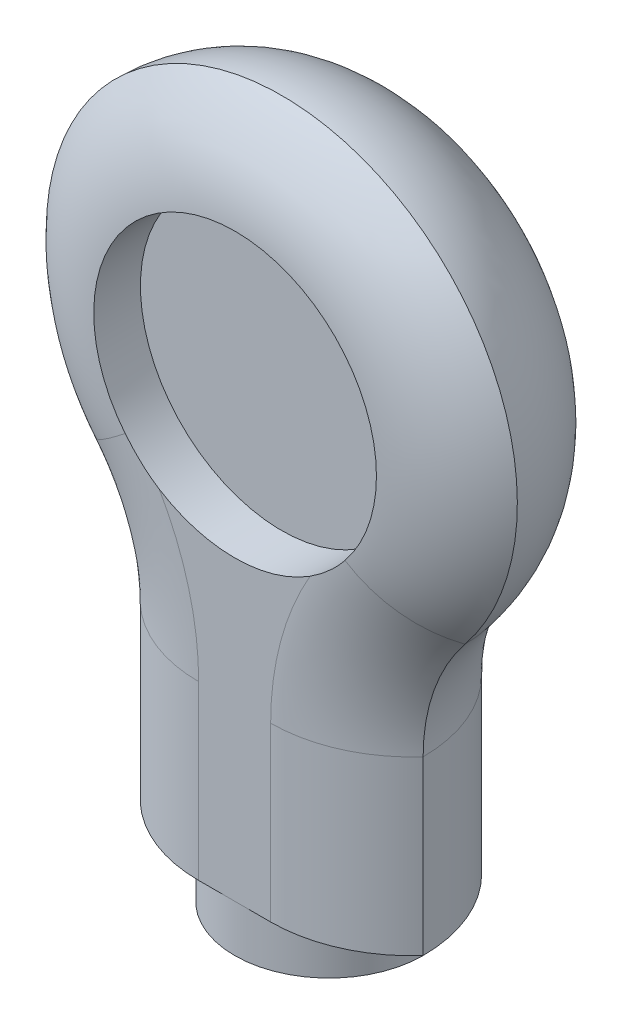
ISO-10303-21;
HEADER;
FILE_DESCRIPTION(('STEP AP214'),'2;1');
FILE_NAME('part.step','',(''),(''),'','','');
FILE_SCHEMA(('AUTOMOTIVE_DESIGN { 1 0 10303 214 1 1 1 1 }'));
ENDSEC;
DATA;
#1=APPLICATION_CONTEXT('core data for automotive mechanical design processes');
#2=APPLICATION_PROTOCOL_DEFINITION('international standard','automotive_design',2000,#1);
#3=PRODUCT_CONTEXT('',#1,'mechanical');
#4=PRODUCT('Part','Part','',(#3));
#5=PRODUCT_RELATED_PRODUCT_CATEGORY('part','',(#4));
#6=PRODUCT_DEFINITION_FORMATION('','',#4);
#7=PRODUCT_DEFINITION_CONTEXT('part definition',#1,'design');
#8=PRODUCT_DEFINITION('design','',#6,#7);
#9=PRODUCT_DEFINITION_SHAPE('','',#8);
#10=(LENGTH_UNIT() NAMED_UNIT(*) SI_UNIT(.MILLI.,.METRE.));
#11=(NAMED_UNIT(*) PLANE_ANGLE_UNIT() SI_UNIT($,.RADIAN.));
#12=(NAMED_UNIT(*) SI_UNIT($,.STERADIAN.) SOLID_ANGLE_UNIT());
#13=UNCERTAINTY_MEASURE_WITH_UNIT(LENGTH_MEASURE(1.E-05),#10,'distance_accuracy_value','');
#14=(GEOMETRIC_REPRESENTATION_CONTEXT(3) GLOBAL_UNCERTAINTY_ASSIGNED_CONTEXT((#13)) GLOBAL_UNIT_ASSIGNED_CONTEXT((#10,
#11,#12)) REPRESENTATION_CONTEXT('',''));
#15=CARTESIAN_POINT('',(0.,0.,0.));
#16=DIRECTION('',(0.,0.,1.));
#17=DIRECTION('',(1.,0.,0.));
#18=AXIS2_PLACEMENT_3D('',#15,#16,#17);
#19=CARTESIAN_POINT('',(1448.97204941986,-6.55492904493826,-19.9999999999894));
#20=DIRECTION('',(0.,1.,0.));
#21=DIRECTION('',(0.,0.,1.));
#22=AXIS2_PLACEMENT_3D('',#19,#20,#21);
#23=PLANE('',#22);
#24=CARTESIAN_POINT('',(1448.97204941986,-6.55492904493826,-4.9999999999894));
#25=DIRECTION('',(0.,1.,0.));
#26=DIRECTION('',(0.,0.,1.));
#27=AXIS2_PLACEMENT_3D('',#24,#25,#26);
#28=CIRCLE('',#27,15.);
#29=CARTESIAN_POINT('',(1448.97204941986,-6.55492904493826,-19.9999999999895));
#30=VERTEX_POINT('',#29);
#31=CARTESIAN_POINT('',(1463.97204941986,-6.55492904493826,-4.9999999999894));
#32=VERTEX_POINT('',#31);
#33=EDGE_CURVE('E128',#30,#32,#28,.F.);
#34=ORIENTED_EDGE('',*,*,#33,.T.);
#35=CARTESIAN_POINT('',(1452.79170953236,-6.55492904493826,-14.9999999999894));
#36=DIRECTION('',(0.,1.,0.));
#37=DIRECTION('',(0.,0.,1.));
#38=AXIS2_PLACEMENT_3D('',#35,#36,#37);
#39=CIRCLE('',#38,15.);
#40=CARTESIAN_POINT('',(1452.79170953236,-6.55492904493826,1.06026298851702E-11));
#41=VERTEX_POINT('',#40);
#42=EDGE_CURVE('E11',#32,#41,#39,.F.);
#43=ORIENTED_EDGE('',*,*,#42,.T.);
#44=DIRECTION('',(-1.,0.,0.));
#45=VECTOR('',#44,1.);
#46=CARTESIAN_POINT('',(1448.97204941986,-6.55492904493826,1.06026298851702E-11));
#47=LINE('',#46,#45);
#48=CARTESIAN_POINT('',(1448.97204941986,-6.55492904493826,1.06026298851702E-11));
#49=VERTEX_POINT('',#48);
#50=EDGE_CURVE('E131',#41,#49,#47,.T.);
#51=ORIENTED_EDGE('',*,*,#50,.T.);
#52=CARTESIAN_POINT('',(1448.97204941986,-6.55492904493826,-9.9999999999894));
#53=DIRECTION('',(0.,-1.,0.));
#54=DIRECTION('',(0.,0.,-1.));
#55=AXIS2_PLACEMENT_3D('',#52,#53,#54);
#56=CIRCLE('',#55,10.0000000000001);
#57=EDGE_CURVE('E126',#30,#49,#56,.T.);
#58=ORIENTED_EDGE('',*,*,#57,.F.);
#59=EDGE_LOOP('',(#34,#43,#51,#58));
#60=FACE_BOUND('',#59,.T.);
#61=ADVANCED_FACE('F33',(#60),#23,.F.);
#62=CARTESIAN_POINT('',(1445.15238930736,-6.55492904493826,1.06026298851702E-11));
#63=VERTEX_POINT('',#62);
#64=EDGE_CURVE('E283',#49,#63,#47,.T.);
#65=ORIENTED_EDGE('',*,*,#64,.T.);
#66=CARTESIAN_POINT('',(1445.15238930736,-6.55492904493826,-14.9999999999894));
#67=DIRECTION('',(0.,1.,0.));
#68=DIRECTION('',(0.,0.,1.));
#69=AXIS2_PLACEMENT_3D('',#66,#67,#68);
#70=CIRCLE('',#69,15.);
#71=CARTESIAN_POINT('',(1433.97204941986,-6.55492904493826,-4.9999999999894));
#72=VERTEX_POINT('',#71);
#73=EDGE_CURVE('E116',#63,#72,#70,.F.);
#74=ORIENTED_EDGE('',*,*,#73,.T.);
#75=CARTESIAN_POINT('',(1448.97204941986,-6.55492904493826,-4.9999999999894));
#76=DIRECTION('',(0.,1.,0.));
#77=DIRECTION('',(0.,0.,1.));
#78=AXIS2_PLACEMENT_3D('',#75,#76,#77);
#79=CIRCLE('',#78,15.);
#80=EDGE_CURVE('E108',#72,#30,#79,.F.);
#81=ORIENTED_EDGE('',*,*,#80,.T.);
#82=EDGE_CURVE('E113',#49,#30,#56,.T.);
#83=ORIENTED_EDGE('',*,*,#82,.F.);
#84=EDGE_LOOP('',(#65,#74,#81,#83));
#85=FACE_BOUND('',#84,.T.);
#86=ADVANCED_FACE('F111',(#85),#23,.F.);
#87=CARTESIAN_POINT('',(1413.97204941986,11.715728752538,-19.9999999999894));
#88=DIRECTION('',(0.,0.,1.));
#89=DIRECTION('',(1.,0.,0.));
#90=AXIS2_PLACEMENT_3D('',#87,#88,#89);
#91=PLANE('',#90);
#92=CARTESIAN_POINT('',(1483.97204941986,11.715728752538,-19.9999999999894));
#93=DIRECTION('',(0.,0.,1.));
#94=DIRECTION('',(1.,0.,0.));
#95=AXIS2_PLACEMENT_3D('',#92,#93,#94);
#96=CIRCLE('',#95,34.9999999999999);
#97=CARTESIAN_POINT('',(1456.74982719764,33.7146063894528,-19.9999999999894));
#98=VERTEX_POINT('',#97);
#99=CARTESIAN_POINT('',(1448.97204941986,11.715728752538,-19.9999999999894));
#100=VERTEX_POINT('',#99);
#101=EDGE_CURVE('E246',#98,#100,#96,.T.);
#102=ORIENTED_EDGE('',*,*,#101,.T.);
#103=CARTESIAN_POINT('',(1413.97204941986,11.715728752538,-19.9999999999894));
#104=DIRECTION('',(0.,0.,1.));
#105=DIRECTION('',(1.,0.,0.));
#106=AXIS2_PLACEMENT_3D('',#103,#104,#105);
#107=CIRCLE('',#106,35.0000000000001);
#108=CARTESIAN_POINT('',(1441.19427164209,33.7146063894526,-19.9999999999894));
#109=VERTEX_POINT('',#108);
#110=EDGE_CURVE('E249',#100,#109,#107,.T.);
#111=ORIENTED_EDGE('',*,*,#110,.T.);
#112=CARTESIAN_POINT('',(1448.97204941986,40.,-19.9999999999894));
#113=DIRECTION('',(0.,0.,1.));
#114=DIRECTION('',(1.,0.,0.));
#115=AXIS2_PLACEMENT_3D('',#112,#113,#114);
#116=CIRCLE('',#115,9.99999999999998);
#117=EDGE_CURVE('E121',#109,#98,#116,.F.);
#118=ORIENTED_EDGE('',*,*,#117,.T.);
#119=EDGE_LOOP('',(#102,#111,#118));
#120=FACE_BOUND('',#119,.T.);
#121=ADVANCED_FACE('F219',(#120),#91,.F.);
#122=CARTESIAN_POINT('',(1413.97204941986,11.715728752538,1.06026298851702E-11));
#123=DIRECTION('',(0.,0.,1.));
#124=DIRECTION('',(1.,0.,0.));
#125=AXIS2_PLACEMENT_3D('',#122,#123,#124);
#126=PLANE('',#125);
#127=CARTESIAN_POINT('',(1413.97204941986,11.715728752538,1.06026298851702E-11));
#128=DIRECTION('',(0.,0.,1.));
#129=DIRECTION('',(1.,0.,0.));
#130=AXIS2_PLACEMENT_3D('',#127,#128,#129);
#131=CIRCLE('',#130,31.1803398874991);
#132=CARTESIAN_POINT('',(1440.9716979601,27.3116440576298,3.34515958499169E-12));
#133=VERTEX_POINT('',#132);
#134=CARTESIAN_POINT('',(1445.15238930736,11.715728752538,1.06026298851702E-11));
#135=VERTEX_POINT('',#134);
#136=EDGE_CURVE('E167',#133,#135,#131,.F.);
#137=ORIENTED_EDGE('',*,*,#136,.T.);
#138=DIRECTION('',(0.,-1.,0.));
#139=VECTOR('',#138,1.);
#140=CARTESIAN_POINT('',(1445.15238930736,-6.55492904493826,1.06026298851702E-11));
#141=LINE('',#140,#139);
#142=EDGE_CURVE('E169',#135,#63,#141,.T.);
#143=ORIENTED_EDGE('',*,*,#142,.T.);
#144=ORIENTED_EDGE('',*,*,#64,.F.);
#145=ORIENTED_EDGE('',*,*,#50,.F.);
#146=DIRECTION('',(0.,-1.,0.));
#147=VECTOR('',#146,1.);
#148=CARTESIAN_POINT('',(1452.79170953236,11.715728752538,1.06026298851702E-11));
#149=LINE('',#148,#147);
#150=CARTESIAN_POINT('',(1452.79170953236,11.715728752538,1.06026298851702E-11));
#151=VERTEX_POINT('',#150);
#152=EDGE_CURVE('E164',#41,#151,#149,.F.);
#153=ORIENTED_EDGE('',*,*,#152,.T.);
#154=CARTESIAN_POINT('',(1483.97204941986,11.715728752538,1.06026298851702E-11));
#155=DIRECTION('',(0.,0.,1.));
#156=DIRECTION('',(1.,0.,0.));
#157=AXIS2_PLACEMENT_3D('',#154,#155,#156);
#158=CIRCLE('',#157,31.1803398874989);
#159=CARTESIAN_POINT('',(1456.97240087963,27.3116440576301,0.));
#160=VERTEX_POINT('',#159);
#161=EDGE_CURVE('E162',#151,#160,#158,.F.);
#162=ORIENTED_EDGE('',*,*,#161,.T.);
#163=CARTESIAN_POINT('',(1448.97204941986,40.,0.));
#164=DIRECTION('',(0.,0.,1.));
#165=DIRECTION('',(1.,0.,0.));
#166=AXIS2_PLACEMENT_3D('',#163,#164,#165);
#167=CIRCLE('',#166,14.9999999999999);
#168=EDGE_CURVE('E275',#133,#160,#167,.T.);
#169=ORIENTED_EDGE('',*,*,#168,.F.);
#170=EDGE_LOOP('',(#137,#143,#144,#145,#153,#162,#169));
#171=FACE_BOUND('',#170,.T.);
#172=ADVANCED_FACE('F222',(#171),#126,.T.);
#173=CARTESIAN_POINT('',(1448.97204941986,-11.5549290449383,-9.9999999999894));
#174=DIRECTION('',(0.,1.,0.));
#175=DIRECTION('',(0.,0.,1.));
#176=AXIS2_PLACEMENT_3D('',#173,#174,#175);
#177=CYLINDRICAL_SURFACE('',#176,10.0000000000001);
#178=CARTESIAN_POINT('',(1448.97204941986,-11.5549290449383,-9.9999999999894));
#179=DIRECTION('',(0.,-1.,0.));
#180=DIRECTION('',(0.,0.,-1.));
#181=AXIS2_PLACEMENT_3D('',#178,#179,#180);
#182=CIRCLE('',#181,10.0000000000001);
#183=CARTESIAN_POINT('',(1448.97204941986,-11.5549290449383,-19.9999999999895));
#184=VERTEX_POINT('',#183);
#185=EDGE_CURVE('E133',#184,#184,#182,.T.);
#186=ORIENTED_EDGE('',*,*,#185,.F.);
#187=EDGE_LOOP('',(#186));
#188=FACE_BOUND('',#187,.T.);
#189=ORIENTED_EDGE('',*,*,#57,.T.);
#190=ORIENTED_EDGE('',*,*,#82,.T.);
#191=EDGE_LOOP('',(#189,#190));
#192=FACE_BOUND('',#191,.T.);
#193=ADVANCED_FACE('F136',(#188,#192),#177,.T.);
#194=CARTESIAN_POINT('',(1448.97204941986,-11.5549290449383,-9.9999999999894));
#195=DIRECTION('',(0.,-1.,0.));
#196=DIRECTION('',(0.,0.,-1.));
#197=AXIS2_PLACEMENT_3D('',#194,#195,#196);
#198=PLANE('',#197);
#199=ORIENTED_EDGE('',*,*,#185,.T.);
#200=EDGE_LOOP('',(#199));
#201=FACE_BOUND('',#200,.T.);
#202=ADVANCED_FACE('F189',(#201),#198,.T.);
#203=CARTESIAN_POINT('',(1483.97204941986,11.715728752538,-4.9999999999894));
#204=DIRECTION('',(0.,0.,1.));
#205=DIRECTION('',(1.,0.,0.));
#206=AXIS2_PLACEMENT_3D('',#203,#204,#205);
#207=TOROIDAL_SURFACE('',#206,34.9999999999999,15.);
#208=CARTESIAN_POINT('',(1448.97204941986,11.715728752538,-4.9999999999894));
#209=DIRECTION('',(0.,-1.,0.));
#210=DIRECTION('',(0.,0.,-1.));
#211=AXIS2_PLACEMENT_3D('',#208,#209,#210);
#212=CIRCLE('',#211,15.);
#213=CARTESIAN_POINT('',(1463.97204941986,11.715728752538,-4.9999999999894));
#214=VERTEX_POINT('',#213);
#215=EDGE_CURVE('E153',#100,#214,#212,.T.);
#216=ORIENTED_EDGE('',*,*,#215,.F.);
#217=ORIENTED_EDGE('',*,*,#101,.F.);
#218=CARTESIAN_POINT('',(1456.74982719764,33.7146063894529,-4.9999999999894));
#219=DIRECTION('',(0.628539361054708,0.777777777777778,0.));
#220=DIRECTION('',(-0.777777777777778,0.628539361054708,0.));
#221=AXIS2_PLACEMENT_3D('',#218,#219,#220);
#222=CIRCLE('',#221,15.);
#223=CARTESIAN_POINT('',(1468.41649386431,24.2865159736323,-4.9999999999894));
#224=VERTEX_POINT('',#223);
#225=EDGE_CURVE('E134',#224,#98,#222,.T.);
#226=ORIENTED_EDGE('',*,*,#225,.F.);
#227=CARTESIAN_POINT('',(1483.97204941986,11.715728752538,-4.9999999999894));
#228=DIRECTION('',(0.,0.,1.));
#229=DIRECTION('',(1.,0.,0.));
#230=AXIS2_PLACEMENT_3D('',#227,#228,#229);
#231=CIRCLE('',#230,19.9999999999999);
#232=EDGE_CURVE('E146',#214,#224,#231,.F.);
#233=ORIENTED_EDGE('',*,*,#232,.F.);
#234=EDGE_LOOP('',(#216,#217,#226,#233));
#235=FACE_BOUND('',#234,.T.);
#236=ADVANCED_FACE('F234',(#235),#207,.T.);
#237=CARTESIAN_POINT('',(1448.97204941986,40.,-4.9999999999894));
#238=DIRECTION('',(0.,0.,1.));
#239=DIRECTION('',(1.,0.,0.));
#240=AXIS2_PLACEMENT_3D('',#237,#238,#239);
#241=DEGENERATE_TOROIDAL_SURFACE('',#240,9.99999999999998,15.,.T.);
#242=ORIENTED_EDGE('',*,*,#225,.T.);
#243=ORIENTED_EDGE('',*,*,#117,.F.);
#244=CARTESIAN_POINT('',(1441.19427164209,33.7146063894528,-4.9999999999894));
#245=DIRECTION('',(0.628539361054722,-0.777777777777768,0.));
#246=DIRECTION('',(0.777777777777768,0.628539361054722,0.));
#247=AXIS2_PLACEMENT_3D('',#244,#245,#246);
#248=CIRCLE('',#247,15.);
#249=CARTESIAN_POINT('',(1429.52760497542,24.2865159736321,-4.9999999999894));
#250=VERTEX_POINT('',#249);
#251=EDGE_CURVE('E151',#250,#109,#248,.T.);
#252=ORIENTED_EDGE('',*,*,#251,.F.);
#253=CARTESIAN_POINT('',(1448.97204941986,40.,-4.9999999999894));
#254=DIRECTION('',(0.,0.,1.));
#255=DIRECTION('',(1.,0.,0.));
#256=AXIS2_PLACEMENT_3D('',#253,#254,#255);
#257=CIRCLE('',#256,25.);
#258=EDGE_CURVE('E165',#224,#250,#257,.T.);
#259=ORIENTED_EDGE('',*,*,#258,.F.);
#260=EDGE_LOOP('',(#242,#243,#252,#259));
#261=FACE_BOUND('',#260,.T.);
#262=ADVANCED_FACE('F232',(#261),#241,.T.);
#263=CARTESIAN_POINT('',(1448.97204941986,-6.55492904493826,-4.9999999999894));
#264=DIRECTION('',(0.,-1.,0.));
#265=DIRECTION('',(0.,0.,-1.));
#266=AXIS2_PLACEMENT_3D('',#263,#264,#265);
#267=CYLINDRICAL_SURFACE('',#266,15.);
#268=DIRECTION('',(0.,1.,0.));
#269=VECTOR('',#268,1.);
#270=CARTESIAN_POINT('',(1463.97204941986,11.715728752538,-4.9999999999894));
#271=LINE('',#270,#269);
#272=EDGE_CURVE('E144',#32,#214,#271,.T.);
#273=ORIENTED_EDGE('',*,*,#272,.F.);
#274=ORIENTED_EDGE('',*,*,#33,.F.);
#275=DIRECTION('',(0.,1.,0.));
#276=VECTOR('',#275,1.);
#277=CARTESIAN_POINT('',(1448.97204941986,-6.55492904493826,-19.9999999999894));
#278=LINE('',#277,#276);
#279=EDGE_CURVE('E141',#100,#30,#278,.F.);
#280=ORIENTED_EDGE('',*,*,#279,.F.);
#281=ORIENTED_EDGE('',*,*,#215,.T.);
#282=EDGE_LOOP('',(#273,#274,#280,#281));
#283=FACE_BOUND('',#282,.T.);
#284=ADVANCED_FACE('F139',(#283),#267,.T.);
#285=CARTESIAN_POINT('',(1413.97204941986,11.715728752538,-4.9999999999894));
#286=DIRECTION('',(0.,0.,1.));
#287=DIRECTION('',(1.,0.,0.));
#288=AXIS2_PLACEMENT_3D('',#285,#286,#287);
#289=TOROIDAL_SURFACE('',#288,35.0000000000001,15.);
#290=ORIENTED_EDGE('',*,*,#251,.T.);
#291=ORIENTED_EDGE('',*,*,#110,.F.);
#292=CARTESIAN_POINT('',(1448.97204941986,11.715728752538,-4.9999999999894));
#293=DIRECTION('',(0.,-1.,0.));
#294=DIRECTION('',(0.,0.,-1.));
#295=AXIS2_PLACEMENT_3D('',#292,#293,#294);
#296=CIRCLE('',#295,15.);
#297=CARTESIAN_POINT('',(1433.97204941986,11.715728752538,-4.9999999999894));
#298=VERTEX_POINT('',#297);
#299=EDGE_CURVE('E150',#298,#100,#296,.T.);
#300=ORIENTED_EDGE('',*,*,#299,.F.);
#301=CARTESIAN_POINT('',(1413.97204941986,11.715728752538,-4.9999999999894));
#302=DIRECTION('',(0.,0.,1.));
#303=DIRECTION('',(1.,0.,0.));
#304=AXIS2_PLACEMENT_3D('',#301,#302,#303);
#305=CIRCLE('',#304,20.0000000000001);
#306=EDGE_CURVE('E253',#250,#298,#305,.F.);
#307=ORIENTED_EDGE('',*,*,#306,.F.);
#308=EDGE_LOOP('',(#290,#291,#300,#307));
#309=FACE_BOUND('',#308,.T.);
#310=ADVANCED_FACE('F226',(#309),#289,.T.);
#311=CARTESIAN_POINT('',(1448.97204941986,11.715728752538,-4.9999999999894));
#312=DIRECTION('',(0.,1.,0.));
#313=DIRECTION('',(0.,0.,1.));
#314=AXIS2_PLACEMENT_3D('',#311,#312,#313);
#315=CYLINDRICAL_SURFACE('',#314,15.);
#316=ORIENTED_EDGE('',*,*,#80,.F.);
#317=DIRECTION('',(0.,1.,0.));
#318=VECTOR('',#317,1.);
#319=CARTESIAN_POINT('',(1433.97204941986,-6.55492904493826,-4.9999999999894));
#320=LINE('',#319,#318);
#321=EDGE_CURVE('E122',#298,#72,#320,.F.);
#322=ORIENTED_EDGE('',*,*,#321,.F.);
#323=ORIENTED_EDGE('',*,*,#299,.T.);
#324=ORIENTED_EDGE('',*,*,#279,.T.);
#325=EDGE_LOOP('',(#316,#322,#323,#324));
#326=FACE_BOUND('',#325,.T.);
#327=ADVANCED_FACE('F148',(#326),#315,.T.);
#328=CARTESIAN_POINT('',(1448.97204941986,40.,-5.));
#329=DIRECTION('',(0.,0.,1.));
#330=DIRECTION('',(1.,0.,0.));
#331=AXIS2_PLACEMENT_3D('',#328,#329,#330);
#332=CYLINDRICAL_SURFACE('',#331,14.9999999999999);
#333=CARTESIAN_POINT('',(1448.97204941986,40.,-5.));
#334=DIRECTION('',(0.,0.,1.));
#335=DIRECTION('',(1.,0.,0.));
#336=AXIS2_PLACEMENT_3D('',#333,#334,#335);
#337=CIRCLE('',#336,14.9999999999999);
#338=CARTESIAN_POINT('',(1463.97204941986,40.,-5.));
#339=VERTEX_POINT('',#338);
#340=EDGE_CURVE('E155',#339,#339,#337,.T.);
#341=ORIENTED_EDGE('',*,*,#340,.F.);
#342=EDGE_LOOP('',(#341));
#343=FACE_BOUND('',#342,.T.);
#344=CARTESIAN_POINT('',(1448.97204941986,40.,-0.0465121877771865));
#345=DIRECTION('',(0.,0.,-1.));
#346=DIRECTION('',(-1.,0.,0.));
#347=AXIS2_PLACEMENT_3D('',#344,#345,#346);
#348=CIRCLE('',#347,14.9999999999999);
#349=CARTESIAN_POINT('',(1460.63871608653,30.5719095841794,-0.04651218777718));
#350=VERTEX_POINT('',#349);
#351=CARTESIAN_POINT('',(1437.3053827532,30.5719095841793,-0.0465121877771865));
#352=VERTEX_POINT('',#351);
#353=EDGE_CURVE('E50',#350,#352,#348,.F.);
#354=ORIENTED_EDGE('',*,*,#353,.T.);
#355=CARTESIAN_POINT('',(1437.3053827532,30.5719095841793,-0.0465121877771918));
#356=CARTESIAN_POINT('',(1437.43618311739,30.4100485678065,-0.0465309839785682));
#357=CARTESIAN_POINT('',(1437.57035376509,30.2509149507525,-0.0459998846278343));
#358=CARTESIAN_POINT('',(1437.84519245818,29.9383728710314,-0.0439749526490925));
#359=CARTESIAN_POINT('',(1437.98586037443,29.784964294677,-0.0424811391493526));
#360=CARTESIAN_POINT('',(1438.27247335858,29.4851636896762,-0.0386808510805905));
#361=CARTESIAN_POINT('',(1438.41837581374,29.3387308890266,-0.036379997572711));
#362=CARTESIAN_POINT('',(1438.71608679679,29.0520340479556,-0.0312308887070344));
#363=CARTESIAN_POINT('',(1438.8678953442,28.911770027925,-0.0283826315399714));
#364=CARTESIAN_POINT('',(1439.33183126082,28.5005712819203,-0.0195097209702995));
#365=CARTESIAN_POINT('',(1439.65253404657,28.2391617423642,-0.0131557829123079));
#366=CARTESIAN_POINT('',(1440.14998953537,27.8667965683068,-0.00573959635628918));
#367=CARTESIAN_POINT('',(1440.3191649487,27.7455758087661,-0.00361629706544626));
#368=CARTESIAN_POINT('',(1440.66242405706,27.5102681108289,-0.000683306802667503));
#369=CARTESIAN_POINT('',(1440.83650789728,27.3961813837844,0.000126345269042937));
#370=CARTESIAN_POINT('',(1441.01292109327,27.2857451543265,-1.72844959785917E-05));
#371=B_SPLINE_CURVE_WITH_KNOTS('',3,(#355,#356,#357,#358,#359,#360,#361,#362,#363,#364,#365,
#366,#367,#368,#369,#370),.UNSPECIFIED.,.F.,.F.,(4,2,2,2,2,2,2,4),(0.,0.624263909691417,
1.24851541620031,1.86850260955208,2.48849185210632,3.72818835962285,4.35243707364945,
4.97670427283109),.UNSPECIFIED.);
#372=EDGE_CURVE('E42',#352,#133,#371,.T.);
#373=ORIENTED_EDGE('',*,*,#372,.T.);
#374=ORIENTED_EDGE('',*,*,#168,.T.);
#375=CARTESIAN_POINT('',(1456.97240087963,27.3116440576301,1.06032426084787E-11));
#376=CARTESIAN_POINT('',(1457.15123191311,27.4243984207738,-9.37733343219652E-06));
#377=CARTESIAN_POINT('',(1457.32767231295,27.5409358347717,-0.000970034716825523));
#378=CARTESIAN_POINT('',(1457.675458799,27.7813532110752,-0.00418976134856236));
#379=CARTESIAN_POINT('',(1457.84680503064,27.9052329634739,-0.006448793494287));
#380=CARTESIAN_POINT('',(1458.18291035089,28.1592186524263,-0.0116428007495715));
#381=CARTESIAN_POINT('',(1458.34770738904,28.2892744865526,-0.0145728936815181));
#382=CARTESIAN_POINT('',(1458.67169754916,28.5561860611124,-0.0206048961859764));
#383=CARTESIAN_POINT('',(1458.83089064828,28.6930418292655,-0.0237068064588981));
#384=CARTESIAN_POINT('',(1459.14339867061,28.973318311317,-0.0296422728024699));
#385=CARTESIAN_POINT('',(1459.29671350239,29.1167391272665,-0.0324758246994948));
#386=CARTESIAN_POINT('',(1459.59719420629,29.4098934527297,-0.0375260686659842));
#387=CARTESIAN_POINT('',(1459.74436009691,29.5596269432619,-0.0397427625901229));
#388=CARTESIAN_POINT('',(1460.03330464326,29.8662290357797,-0.043313558454505));
#389=CARTESIAN_POINT('',(1460.17503765229,30.0231407347247,-0.0446614267944309));
#390=CARTESIAN_POINT('',(1460.45175211615,30.3428191249042,-0.0463451011783258));
#391=CARTESIAN_POINT('',(1460.58673343383,30.5055859349616,-0.0466808866714722));
#392=CARTESIAN_POINT('',(1460.71821036524,30.6711360260076,-0.0464484112449289));
#393=B_SPLINE_CURVE_WITH_KNOTS('',3,(#375,#376,#377,#378,#379,#380,#381,#382,#383,#384,#385,
#386,#387,#388,#389,#390,#391,#392),.UNSPECIFIED.,.F.,.F.,(4,2,2,2,2,2,2,2,4),(0.,
0.634173726909053,1.26832933244284,1.89801010906889,2.52769345276541,3.15738658796092,
3.787077829871,4.42123808622513,5.05541121941751),.UNSPECIFIED.);
#394=EDGE_CURVE('E55',#160,#350,#393,.T.);
#395=ORIENTED_EDGE('',*,*,#394,.T.);
#396=EDGE_LOOP('',(#354,#373,#374,#395));
#397=FACE_BOUND('',#396,.T.);
#398=ADVANCED_FACE('F182',(#343,#397),#332,.F.);
#399=CARTESIAN_POINT('',(1448.97204941986,40.,-5.));
#400=DIRECTION('',(0.,0.,1.));
#401=DIRECTION('',(1.,0.,0.));
#402=AXIS2_PLACEMENT_3D('',#399,#400,#401);
#403=PLANE('',#402);
#404=ORIENTED_EDGE('',*,*,#340,.T.);
#405=EDGE_LOOP('',(#404));
#406=FACE_BOUND('',#405,.T.);
#407=ADVANCED_FACE('F187',(#406),#403,.T.);
#408=CARTESIAN_POINT('',(1452.79170953236,-6.55492904493826,-14.9999999999894));
#409=DIRECTION('',(0.,1.,0.));
#410=DIRECTION('',(0.,0.,1.));
#411=AXIS2_PLACEMENT_3D('',#408,#409,#410);
#412=CYLINDRICAL_SURFACE('',#411,15.);
#413=ORIENTED_EDGE('',*,*,#42,.F.);
#414=ORIENTED_EDGE('',*,*,#272,.T.);
#415=CARTESIAN_POINT('',(1452.79170953236,11.715728752538,-14.9999999999894));
#416=DIRECTION('',(0.,1.,0.));
#417=DIRECTION('',(0.,0.,1.));
#418=AXIS2_PLACEMENT_3D('',#415,#416,#417);
#419=CIRCLE('',#418,15.);
#420=EDGE_CURVE('E37',#151,#214,#419,.T.);
#421=ORIENTED_EDGE('',*,*,#420,.F.);
#422=ORIENTED_EDGE('',*,*,#152,.F.);
#423=EDGE_LOOP('',(#413,#414,#421,#422));
#424=FACE_BOUND('',#423,.T.);
#425=ADVANCED_FACE('F35',(#424),#412,.T.);
#426=CARTESIAN_POINT('',(1483.97204941986,11.715728752538,-14.9999999999894));
#427=DIRECTION('',(0.,0.,1.));
#428=DIRECTION('',(1.,0.,0.));
#429=AXIS2_PLACEMENT_3D('',#426,#427,#428);
#430=TOROIDAL_SURFACE('',#429,31.1803398874989,15.);
#431=ORIENTED_EDGE('',*,*,#420,.T.);
#432=ORIENTED_EDGE('',*,*,#232,.T.);
#433=CARTESIAN_POINT('',(1459.72067395181,31.3137996628954,-14.9999999999894));
#434=DIRECTION('',(0.628539361054712,0.777777777777775,0.));
#435=DIRECTION('',(-0.777777777777775,0.628539361054712,0.));
#436=AXIS2_PLACEMENT_3D('',#433,#434,#435);
#437=CIRCLE('',#436,15.);
#438=EDGE_CURVE('E266',#350,#224,#437,.T.);
#439=ORIENTED_EDGE('',*,*,#438,.F.);
#440=ORIENTED_EDGE('',*,*,#394,.F.);
#441=ORIENTED_EDGE('',*,*,#161,.F.);
#442=EDGE_LOOP('',(#431,#432,#439,#440,#441));
#443=FACE_BOUND('',#442,.T.);
#444=ADVANCED_FACE('F179',(#443),#430,.T.);
#445=CARTESIAN_POINT('',(1448.97204941986,40.,-14.9999999999894));
#446=DIRECTION('',(0.,0.,-1.));
#447=DIRECTION('',(-1.,0.,0.));
#448=AXIS2_PLACEMENT_3D('',#445,#446,#447);
#449=DEGENERATE_TOROIDAL_SURFACE('',#448,13.819660112501,15.,.T.);
#450=ORIENTED_EDGE('',*,*,#438,.T.);
#451=ORIENTED_EDGE('',*,*,#258,.T.);
#452=CARTESIAN_POINT('',(1438.22342488792,31.3137996628953,-14.9999999999894));
#453=DIRECTION('',(0.628539361054718,-0.77777777777777,0.));
#454=DIRECTION('',(0.77777777777777,0.628539361054718,0.));
#455=AXIS2_PLACEMENT_3D('',#452,#453,#454);
#456=CIRCLE('',#455,15.);
#457=EDGE_CURVE('E264',#352,#250,#456,.T.);
#458=ORIENTED_EDGE('',*,*,#457,.F.);
#459=ORIENTED_EDGE('',*,*,#353,.F.);
#460=EDGE_LOOP('',(#450,#451,#458,#459));
#461=FACE_BOUND('',#460,.T.);
#462=ADVANCED_FACE('F203',(#461),#449,.T.);
#463=CARTESIAN_POINT('',(1413.97204941986,11.715728752538,-14.9999999999894));
#464=DIRECTION('',(0.,0.,1.));
#465=DIRECTION('',(1.,0.,0.));
#466=AXIS2_PLACEMENT_3D('',#463,#464,#465);
#467=TOROIDAL_SURFACE('',#466,31.1803398874991,15.);
#468=ORIENTED_EDGE('',*,*,#457,.T.);
#469=ORIENTED_EDGE('',*,*,#306,.T.);
#470=CARTESIAN_POINT('',(1445.15238930736,11.715728752538,-14.9999999999894));
#471=DIRECTION('',(0.,-1.,0.));
#472=DIRECTION('',(0.,0.,-1.));
#473=AXIS2_PLACEMENT_3D('',#470,#471,#472);
#474=CIRCLE('',#473,15.);
#475=EDGE_CURVE('E269',#135,#298,#474,.T.);
#476=ORIENTED_EDGE('',*,*,#475,.F.);
#477=ORIENTED_EDGE('',*,*,#136,.F.);
#478=ORIENTED_EDGE('',*,*,#372,.F.);
#479=EDGE_LOOP('',(#468,#469,#476,#477,#478));
#480=FACE_BOUND('',#479,.T.);
#481=ADVANCED_FACE('F198',(#480),#467,.T.);
#482=CARTESIAN_POINT('',(1445.15238930736,-6.55492904493826,-14.9999999999894));
#483=DIRECTION('',(0.,1.,0.));
#484=DIRECTION('',(0.,0.,1.));
#485=AXIS2_PLACEMENT_3D('',#482,#483,#484);
#486=CYLINDRICAL_SURFACE('',#485,15.);
#487=ORIENTED_EDGE('',*,*,#73,.F.);
#488=ORIENTED_EDGE('',*,*,#142,.F.);
#489=ORIENTED_EDGE('',*,*,#475,.T.);
#490=ORIENTED_EDGE('',*,*,#321,.T.);
#491=EDGE_LOOP('',(#487,#488,#489,#490));
#492=FACE_BOUND('',#491,.T.);
#493=ADVANCED_FACE('F202',(#492),#486,.T.);
#494=CLOSED_SHELL('',(#61,#86,#121,#172,#193,#202,#236,#262,#284,#310,#327,#398,#407,#425,#444,
#462,#481,#493));
#495=MANIFOLD_SOLID_BREP('B2',#494);
#496=ADVANCED_BREP_SHAPE_REPRESENTATION('',(#18,#495),#14);
#497=SHAPE_DEFINITION_REPRESENTATION(#9,#496);
ENDSEC;
END-ISO-10303-21;
